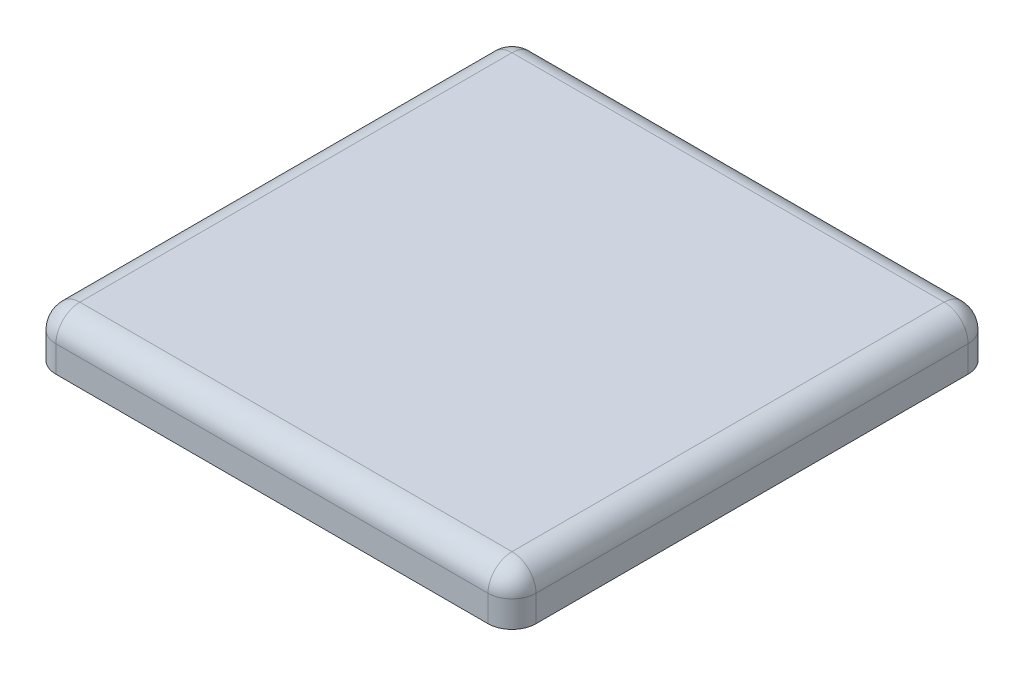
ISO-10303-21;
HEADER;
FILE_DESCRIPTION(('STEP AP214'),'2;1');
FILE_NAME('part.step','',(''),(''),'','','');
FILE_SCHEMA(('AUTOMOTIVE_DESIGN { 1 0 10303 214 1 1 1 1 }'));
ENDSEC;
DATA;
#1=APPLICATION_CONTEXT('core data for automotive mechanical design processes');
#2=APPLICATION_PROTOCOL_DEFINITION('international standard','automotive_design',2000,#1);
#3=PRODUCT_CONTEXT('',#1,'mechanical');
#4=PRODUCT('Part','Part','',(#3));
#5=PRODUCT_RELATED_PRODUCT_CATEGORY('part','',(#4));
#6=PRODUCT_DEFINITION_FORMATION('','',#4);
#7=PRODUCT_DEFINITION_CONTEXT('part definition',#1,'design');
#8=PRODUCT_DEFINITION('design','',#6,#7);
#9=PRODUCT_DEFINITION_SHAPE('','',#8);
#10=(LENGTH_UNIT() NAMED_UNIT(*) SI_UNIT(.MILLI.,.METRE.));
#11=(NAMED_UNIT(*) PLANE_ANGLE_UNIT() SI_UNIT($,.RADIAN.));
#12=(NAMED_UNIT(*) SI_UNIT($,.STERADIAN.) SOLID_ANGLE_UNIT());
#13=UNCERTAINTY_MEASURE_WITH_UNIT(LENGTH_MEASURE(1.E-05),#10,'distance_accuracy_value','');
#14=(GEOMETRIC_REPRESENTATION_CONTEXT(3) GLOBAL_UNCERTAINTY_ASSIGNED_CONTEXT((#13)) GLOBAL_UNIT_ASSIGNED_CONTEXT((#10,
#11,#12)) REPRESENTATION_CONTEXT('',''));
#15=CARTESIAN_POINT('',(0.,0.,0.));
#16=DIRECTION('',(0.,0.,1.));
#17=DIRECTION('',(1.,0.,0.));
#18=AXIS2_PLACEMENT_3D('',#15,#16,#17);
#19=CARTESIAN_POINT('',(-18.,4.2,-18.));
#20=DIRECTION('',(0.,-1.,0.));
#21=DIRECTION('',(0.,0.,-1.));
#22=AXIS2_PLACEMENT_3D('',#19,#20,#21);
#23=CYLINDRICAL_SURFACE('',#22,2.);
#24=DIRECTION('',(0.,-1.,0.));
#25=VECTOR('',#24,1.);
#26=CARTESIAN_POINT('',(-20.,4.2,-18.));
#27=LINE('',#26,#25);
#28=CARTESIAN_POINT('',(-20.,2.2,-18.));
#29=VERTEX_POINT('',#28);
#30=CARTESIAN_POINT('',(-20.,0.,-18.));
#31=VERTEX_POINT('',#30);
#32=EDGE_CURVE('E111',#29,#31,#27,.T.);
#33=ORIENTED_EDGE('',*,*,#32,.F.);
#34=CARTESIAN_POINT('',(-18.,2.2,-18.));
#35=DIRECTION('',(0.,-1.,0.));
#36=DIRECTION('',(0.,0.,-1.));
#37=AXIS2_PLACEMENT_3D('',#34,#35,#36);
#38=CIRCLE('',#37,2.);
#39=CARTESIAN_POINT('',(-18.,2.2,-20.));
#40=VERTEX_POINT('',#39);
#41=EDGE_CURVE('E185',#29,#40,#38,.T.);
#42=ORIENTED_EDGE('',*,*,#41,.T.);
#43=DIRECTION('',(0.,-1.,0.));
#44=VECTOR('',#43,1.);
#45=CARTESIAN_POINT('',(-18.,4.2,-20.));
#46=LINE('',#45,#44);
#47=CARTESIAN_POINT('',(-18.,0.,-20.));
#48=VERTEX_POINT('',#47);
#49=EDGE_CURVE('E134',#40,#48,#46,.T.);
#50=ORIENTED_EDGE('',*,*,#49,.T.);
#51=CARTESIAN_POINT('',(-18.,0.,-18.));
#52=DIRECTION('',(0.,1.,0.));
#53=DIRECTION('',(0.,0.,1.));
#54=AXIS2_PLACEMENT_3D('',#51,#52,#53);
#55=CIRCLE('',#54,2.);
#56=EDGE_CURVE('E129',#48,#31,#55,.T.);
#57=ORIENTED_EDGE('',*,*,#56,.T.);
#58=EDGE_LOOP('',(#33,#42,#50,#57));
#59=FACE_BOUND('',#58,.T.);
#60=ADVANCED_FACE('F33',(#59),#23,.T.);
#61=CARTESIAN_POINT('',(-20.,4.2,18.));
#62=DIRECTION('',(1.,0.,0.));
#63=DIRECTION('',(0.,0.,-1.));
#64=AXIS2_PLACEMENT_3D('',#61,#62,#63);
#65=PLANE('',#64);
#66=DIRECTION('',(0.,-1.,0.));
#67=VECTOR('',#66,1.);
#68=CARTESIAN_POINT('',(-20.,4.2,18.));
#69=LINE('',#68,#67);
#70=CARTESIAN_POINT('',(-20.,2.2,18.));
#71=VERTEX_POINT('',#70);
#72=CARTESIAN_POINT('',(-20.,0.,18.));
#73=VERTEX_POINT('',#72);
#74=EDGE_CURVE('E123',#71,#73,#69,.T.);
#75=ORIENTED_EDGE('',*,*,#74,.F.);
#76=DIRECTION('',(0.,0.,1.));
#77=VECTOR('',#76,1.);
#78=CARTESIAN_POINT('',(-20.,2.2,-18.));
#79=LINE('',#78,#77);
#80=EDGE_CURVE('E118',#71,#29,#79,.F.);
#81=ORIENTED_EDGE('',*,*,#80,.T.);
#82=ORIENTED_EDGE('',*,*,#32,.T.);
#83=DIRECTION('',(0.,0.,1.));
#84=VECTOR('',#83,1.);
#85=CARTESIAN_POINT('',(-20.,0.,18.));
#86=LINE('',#85,#84);
#87=EDGE_CURVE('E115',#31,#73,#86,.T.);
#88=ORIENTED_EDGE('',*,*,#87,.T.);
#89=EDGE_LOOP('',(#75,#81,#82,#88));
#90=FACE_BOUND('',#89,.T.);
#91=ADVANCED_FACE('F114',(#90),#65,.F.);
#92=CARTESIAN_POINT('',(-18.,4.2,18.));
#93=DIRECTION('',(0.,-1.,0.));
#94=DIRECTION('',(0.,0.,-1.));
#95=AXIS2_PLACEMENT_3D('',#92,#93,#94);
#96=CYLINDRICAL_SURFACE('',#95,1.99999999999999);
#97=DIRECTION('',(0.,-1.,0.));
#98=VECTOR('',#97,1.);
#99=CARTESIAN_POINT('',(-18.,4.2,20.));
#100=LINE('',#99,#98);
#101=CARTESIAN_POINT('',(-18.,2.2,20.));
#102=VERTEX_POINT('',#101);
#103=CARTESIAN_POINT('',(-18.,0.,20.));
#104=VERTEX_POINT('',#103);
#105=EDGE_CURVE('E166',#102,#104,#100,.T.);
#106=ORIENTED_EDGE('',*,*,#105,.F.);
#107=CARTESIAN_POINT('',(-18.,2.2,18.));
#108=DIRECTION('',(0.,-1.,0.));
#109=DIRECTION('',(0.,0.,-1.));
#110=AXIS2_PLACEMENT_3D('',#107,#108,#109);
#111=CIRCLE('',#110,1.99999999999999);
#112=EDGE_CURVE('E182',#102,#71,#111,.T.);
#113=ORIENTED_EDGE('',*,*,#112,.T.);
#114=ORIENTED_EDGE('',*,*,#74,.T.);
#115=CARTESIAN_POINT('',(-18.,0.,18.));
#116=DIRECTION('',(0.,1.,0.));
#117=DIRECTION('',(0.,0.,-1.));
#118=AXIS2_PLACEMENT_3D('',#115,#116,#117);
#119=CIRCLE('',#118,1.99999999999999);
#120=EDGE_CURVE('E132',#73,#104,#119,.T.);
#121=ORIENTED_EDGE('',*,*,#120,.T.);
#122=EDGE_LOOP('',(#106,#113,#114,#121));
#123=FACE_BOUND('',#122,.T.);
#124=ADVANCED_FACE('F229',(#123),#96,.T.);
#125=CARTESIAN_POINT('',(-18.,4.2,20.));
#126=DIRECTION('',(0.,0.,-1.));
#127=DIRECTION('',(-1.,0.,0.));
#128=AXIS2_PLACEMENT_3D('',#125,#126,#127);
#129=PLANE('',#128);
#130=DIRECTION('',(0.,-1.,0.));
#131=VECTOR('',#130,1.);
#132=CARTESIAN_POINT('',(18.,4.2,20.));
#133=LINE('',#132,#131);
#134=CARTESIAN_POINT('',(18.,2.2,20.));
#135=VERTEX_POINT('',#134);
#136=CARTESIAN_POINT('',(18.,0.,20.));
#137=VERTEX_POINT('',#136);
#138=EDGE_CURVE('E164',#135,#137,#133,.T.);
#139=ORIENTED_EDGE('',*,*,#138,.F.);
#140=DIRECTION('',(1.,0.,0.));
#141=VECTOR('',#140,1.);
#142=CARTESIAN_POINT('',(-18.,2.2,20.));
#143=LINE('',#142,#141);
#144=EDGE_CURVE('E180',#135,#102,#143,.F.);
#145=ORIENTED_EDGE('',*,*,#144,.T.);
#146=ORIENTED_EDGE('',*,*,#105,.T.);
#147=DIRECTION('',(1.,0.,0.));
#148=VECTOR('',#147,1.);
#149=CARTESIAN_POINT('',(-18.,0.,20.));
#150=LINE('',#149,#148);
#151=EDGE_CURVE('E143',#104,#137,#150,.T.);
#152=ORIENTED_EDGE('',*,*,#151,.T.);
#153=EDGE_LOOP('',(#139,#145,#146,#152));
#154=FACE_BOUND('',#153,.T.);
#155=ADVANCED_FACE('F293',(#154),#129,.F.);
#156=CARTESIAN_POINT('',(18.,4.2,18.));
#157=DIRECTION('',(0.,-1.,0.));
#158=DIRECTION('',(0.,0.,-1.));
#159=AXIS2_PLACEMENT_3D('',#156,#157,#158);
#160=CYLINDRICAL_SURFACE('',#159,2.);
#161=DIRECTION('',(0.,-1.,0.));
#162=VECTOR('',#161,1.);
#163=CARTESIAN_POINT('',(20.,4.2,18.));
#164=LINE('',#163,#162);
#165=CARTESIAN_POINT('',(20.,2.2,18.));
#166=VERTEX_POINT('',#165);
#167=CARTESIAN_POINT('',(20.,0.,18.));
#168=VERTEX_POINT('',#167);
#169=EDGE_CURVE('E162',#166,#168,#164,.T.);
#170=ORIENTED_EDGE('',*,*,#169,.F.);
#171=CARTESIAN_POINT('',(18.,2.2,18.));
#172=DIRECTION('',(0.,-1.,0.));
#173=DIRECTION('',(0.,0.,-1.));
#174=AXIS2_PLACEMENT_3D('',#171,#172,#173);
#175=CIRCLE('',#174,2.);
#176=EDGE_CURVE('E122',#166,#135,#175,.T.);
#177=ORIENTED_EDGE('',*,*,#176,.T.);
#178=ORIENTED_EDGE('',*,*,#138,.T.);
#179=CARTESIAN_POINT('',(18.,0.,18.));
#180=DIRECTION('',(0.,1.,0.));
#181=DIRECTION('',(0.,0.,1.));
#182=AXIS2_PLACEMENT_3D('',#179,#180,#181);
#183=CIRCLE('',#182,2.);
#184=EDGE_CURVE('E146',#137,#168,#183,.T.);
#185=ORIENTED_EDGE('',*,*,#184,.T.);
#186=EDGE_LOOP('',(#170,#177,#178,#185));
#187=FACE_BOUND('',#186,.T.);
#188=ADVANCED_FACE('F283',(#187),#160,.T.);
#189=CARTESIAN_POINT('',(20.,4.2,18.));
#190=DIRECTION('',(-1.,0.,0.));
#191=DIRECTION('',(0.,0.,1.));
#192=AXIS2_PLACEMENT_3D('',#189,#190,#191);
#193=PLANE('',#192);
#194=DIRECTION('',(0.,-1.,0.));
#195=VECTOR('',#194,1.);
#196=CARTESIAN_POINT('',(20.,4.2,-18.));
#197=LINE('',#196,#195);
#198=CARTESIAN_POINT('',(20.,2.2,-18.));
#199=VERTEX_POINT('',#198);
#200=CARTESIAN_POINT('',(20.,0.,-18.));
#201=VERTEX_POINT('',#200);
#202=EDGE_CURVE('E160',#199,#201,#197,.T.);
#203=ORIENTED_EDGE('',*,*,#202,.F.);
#204=DIRECTION('',(0.,0.,-1.));
#205=VECTOR('',#204,1.);
#206=CARTESIAN_POINT('',(20.,2.2,18.));
#207=LINE('',#206,#205);
#208=EDGE_CURVE('E189',#199,#166,#207,.F.);
#209=ORIENTED_EDGE('',*,*,#208,.T.);
#210=ORIENTED_EDGE('',*,*,#169,.T.);
#211=DIRECTION('',(0.,0.,-1.));
#212=VECTOR('',#211,1.);
#213=CARTESIAN_POINT('',(20.,0.,18.));
#214=LINE('',#213,#212);
#215=EDGE_CURVE('E149',#168,#201,#214,.T.);
#216=ORIENTED_EDGE('',*,*,#215,.T.);
#217=EDGE_LOOP('',(#203,#209,#210,#216));
#218=FACE_BOUND('',#217,.T.);
#219=ADVANCED_FACE('F280',(#218),#193,.F.);
#220=CARTESIAN_POINT('',(18.,4.2,-18.));
#221=DIRECTION('',(0.,-1.,0.));
#222=DIRECTION('',(0.,0.,-1.));
#223=AXIS2_PLACEMENT_3D('',#220,#221,#222);
#224=CYLINDRICAL_SURFACE('',#223,2.);
#225=DIRECTION('',(0.,-1.,0.));
#226=VECTOR('',#225,1.);
#227=CARTESIAN_POINT('',(18.,4.2,-20.));
#228=LINE('',#227,#226);
#229=CARTESIAN_POINT('',(18.,2.2,-20.));
#230=VERTEX_POINT('',#229);
#231=CARTESIAN_POINT('',(18.,0.,-20.));
#232=VERTEX_POINT('',#231);
#233=EDGE_CURVE('E158',#230,#232,#228,.T.);
#234=ORIENTED_EDGE('',*,*,#233,.F.);
#235=CARTESIAN_POINT('',(18.,2.2,-18.));
#236=DIRECTION('',(0.,-1.,0.));
#237=DIRECTION('',(0.,0.,-1.));
#238=AXIS2_PLACEMENT_3D('',#235,#236,#237);
#239=CIRCLE('',#238,2.);
#240=EDGE_CURVE('E48',#230,#199,#239,.T.);
#241=ORIENTED_EDGE('',*,*,#240,.T.);
#242=ORIENTED_EDGE('',*,*,#202,.T.);
#243=CARTESIAN_POINT('',(18.,0.,-18.));
#244=DIRECTION('',(0.,1.,0.));
#245=DIRECTION('',(0.,0.,-1.));
#246=AXIS2_PLACEMENT_3D('',#243,#244,#245);
#247=CIRCLE('',#246,2.);
#248=EDGE_CURVE('E152',#201,#232,#247,.T.);
#249=ORIENTED_EDGE('',*,*,#248,.T.);
#250=EDGE_LOOP('',(#234,#241,#242,#249));
#251=FACE_BOUND('',#250,.T.);
#252=ADVANCED_FACE('F304',(#251),#224,.T.);
#253=CARTESIAN_POINT('',(-18.,4.2,-20.));
#254=DIRECTION('',(0.,0.,1.));
#255=DIRECTION('',(1.,0.,0.));
#256=AXIS2_PLACEMENT_3D('',#253,#254,#255);
#257=PLANE('',#256);
#258=ORIENTED_EDGE('',*,*,#49,.F.);
#259=DIRECTION('',(-1.,0.,0.));
#260=VECTOR('',#259,1.);
#261=CARTESIAN_POINT('',(18.,2.2,-20.));
#262=LINE('',#261,#260);
#263=EDGE_CURVE('E56',#40,#230,#262,.F.);
#264=ORIENTED_EDGE('',*,*,#263,.T.);
#265=ORIENTED_EDGE('',*,*,#233,.T.);
#266=DIRECTION('',(-1.,0.,0.));
#267=VECTOR('',#266,1.);
#268=CARTESIAN_POINT('',(-18.,0.,-20.));
#269=LINE('',#268,#267);
#270=EDGE_CURVE('E155',#232,#48,#269,.T.);
#271=ORIENTED_EDGE('',*,*,#270,.T.);
#272=EDGE_LOOP('',(#258,#264,#265,#271));
#273=FACE_BOUND('',#272,.T.);
#274=ADVANCED_FACE('F299',(#273),#257,.F.);
#275=CARTESIAN_POINT('',(-18.,4.2,-18.));
#276=DIRECTION('',(0.,1.,0.));
#277=DIRECTION('',(0.,0.,1.));
#278=AXIS2_PLACEMENT_3D('',#275,#276,#277);
#279=PLANE('',#278);
#280=DIRECTION('',(0.,0.,1.));
#281=VECTOR('',#280,1.);
#282=CARTESIAN_POINT('',(-18.,4.2,18.));
#283=LINE('',#282,#281);
#284=CARTESIAN_POINT('',(-18.,4.2,-18.));
#285=VERTEX_POINT('',#284);
#286=CARTESIAN_POINT('',(-18.,4.2,18.));
#287=VERTEX_POINT('',#286);
#288=EDGE_CURVE('E175',#285,#287,#283,.T.);
#289=ORIENTED_EDGE('',*,*,#288,.T.);
#290=DIRECTION('',(1.,0.,0.));
#291=VECTOR('',#290,1.);
#292=CARTESIAN_POINT('',(18.,4.2,18.));
#293=LINE('',#292,#291);
#294=CARTESIAN_POINT('',(18.,4.2,18.));
#295=VERTEX_POINT('',#294);
#296=EDGE_CURVE('E177',#287,#295,#293,.T.);
#297=ORIENTED_EDGE('',*,*,#296,.T.);
#298=DIRECTION('',(0.,0.,-1.));
#299=VECTOR('',#298,1.);
#300=CARTESIAN_POINT('',(18.,4.2,-18.));
#301=LINE('',#300,#299);
#302=CARTESIAN_POINT('',(18.,4.2,-18.));
#303=VERTEX_POINT('',#302);
#304=EDGE_CURVE('E171',#295,#303,#301,.T.);
#305=ORIENTED_EDGE('',*,*,#304,.T.);
#306=DIRECTION('',(-1.,0.,0.));
#307=VECTOR('',#306,1.);
#308=CARTESIAN_POINT('',(-18.,4.2,-18.));
#309=LINE('',#308,#307);
#310=EDGE_CURVE('E173',#303,#285,#309,.T.);
#311=ORIENTED_EDGE('',*,*,#310,.T.);
#312=EDGE_LOOP('',(#289,#297,#305,#311));
#313=FACE_BOUND('',#312,.T.);
#314=ADVANCED_FACE('F266',(#313),#279,.T.);
#315=CARTESIAN_POINT('',(-18.,0.,-18.));
#316=DIRECTION('',(0.,1.,0.));
#317=DIRECTION('',(0.,0.,1.));
#318=AXIS2_PLACEMENT_3D('',#315,#316,#317);
#319=PLANE('',#318);
#320=CARTESIAN_POINT('',(0.,0.,0.));
#321=DIRECTION('',(0.,1.,0.));
#322=DIRECTION('',(0.,0.,1.));
#323=AXIS2_PLACEMENT_3D('',#320,#321,#322);
#324=CIRCLE('',#323,3.5);
#325=CARTESIAN_POINT('',(0.,0.,3.5));
#326=VERTEX_POINT('',#325);
#327=EDGE_CURVE('E191',#326,#326,#324,.F.);
#328=ORIENTED_EDGE('',*,*,#327,.F.);
#329=EDGE_LOOP('',(#328));
#330=FACE_BOUND('',#329,.T.);
#331=ORIENTED_EDGE('',*,*,#56,.F.);
#332=ORIENTED_EDGE('',*,*,#270,.F.);
#333=ORIENTED_EDGE('',*,*,#248,.F.);
#334=ORIENTED_EDGE('',*,*,#215,.F.);
#335=ORIENTED_EDGE('',*,*,#184,.F.);
#336=ORIENTED_EDGE('',*,*,#151,.F.);
#337=ORIENTED_EDGE('',*,*,#120,.F.);
#338=ORIENTED_EDGE('',*,*,#87,.F.);
#339=EDGE_LOOP('',(#331,#332,#333,#334,#335,#336,#337,#338));
#340=FACE_BOUND('',#339,.T.);
#341=ADVANCED_FACE('F127',(#330,#340),#319,.F.);
#342=CARTESIAN_POINT('',(-18.,2.2,-18.));
#343=DIRECTION('',(0.,1.,0.));
#344=DIRECTION('',(0.,0.,1.));
#345=AXIS2_PLACEMENT_3D('',#342,#343,#344);
#346=SPHERICAL_SURFACE('',#345,2.);
#347=CARTESIAN_POINT('',(-18.,2.2,-18.));
#348=DIRECTION('',(1.,0.,0.));
#349=DIRECTION('',(0.,0.,-1.));
#350=AXIS2_PLACEMENT_3D('',#347,#348,#349);
#351=CIRCLE('',#350,2.);
#352=EDGE_CURVE('E139',#40,#285,#351,.T.);
#353=ORIENTED_EDGE('',*,*,#352,.F.);
#354=ORIENTED_EDGE('',*,*,#41,.F.);
#355=CARTESIAN_POINT('',(-18.,2.2,-18.));
#356=DIRECTION('',(0.,0.,1.));
#357=DIRECTION('',(1.,0.,0.));
#358=AXIS2_PLACEMENT_3D('',#355,#356,#357);
#359=CIRCLE('',#358,2.);
#360=EDGE_CURVE('E136',#285,#29,#359,.T.);
#361=ORIENTED_EDGE('',*,*,#360,.F.);
#362=EDGE_LOOP('',(#353,#354,#361));
#363=FACE_BOUND('',#362,.T.);
#364=ADVANCED_FACE('F259',(#363),#346,.T.);
#365=CARTESIAN_POINT('',(-18.,2.2,-18.));
#366=DIRECTION('',(0.,0.,-1.));
#367=DIRECTION('',(-1.,0.,0.));
#368=AXIS2_PLACEMENT_3D('',#365,#366,#367);
#369=CYLINDRICAL_SURFACE('',#368,2.);
#370=ORIENTED_EDGE('',*,*,#360,.T.);
#371=ORIENTED_EDGE('',*,*,#80,.F.);
#372=CARTESIAN_POINT('',(-18.,2.2,18.));
#373=DIRECTION('',(0.,0.,1.));
#374=DIRECTION('',(1.,0.,0.));
#375=AXIS2_PLACEMENT_3D('',#372,#373,#374);
#376=CIRCLE('',#375,2.);
#377=EDGE_CURVE('E205',#287,#71,#376,.T.);
#378=ORIENTED_EDGE('',*,*,#377,.F.);
#379=ORIENTED_EDGE('',*,*,#288,.F.);
#380=EDGE_LOOP('',(#370,#371,#378,#379));
#381=FACE_BOUND('',#380,.T.);
#382=ADVANCED_FACE('F256',(#381),#369,.T.);
#383=CARTESIAN_POINT('',(-18.,2.2,-18.));
#384=DIRECTION('',(1.,0.,0.));
#385=DIRECTION('',(0.,0.,-1.));
#386=AXIS2_PLACEMENT_3D('',#383,#384,#385);
#387=CYLINDRICAL_SURFACE('',#386,2.);
#388=ORIENTED_EDGE('',*,*,#352,.T.);
#389=ORIENTED_EDGE('',*,*,#310,.F.);
#390=CARTESIAN_POINT('',(18.,2.2,-18.));
#391=DIRECTION('',(1.,0.,0.));
#392=DIRECTION('',(0.,0.,-1.));
#393=AXIS2_PLACEMENT_3D('',#390,#391,#392);
#394=CIRCLE('',#393,2.);
#395=EDGE_CURVE('E202',#230,#303,#394,.T.);
#396=ORIENTED_EDGE('',*,*,#395,.F.);
#397=ORIENTED_EDGE('',*,*,#263,.F.);
#398=EDGE_LOOP('',(#388,#389,#396,#397));
#399=FACE_BOUND('',#398,.T.);
#400=ADVANCED_FACE('F252',(#399),#387,.T.);
#401=CARTESIAN_POINT('',(-18.,2.2,18.));
#402=DIRECTION('',(0.,1.,0.));
#403=DIRECTION('',(0.,0.,1.));
#404=AXIS2_PLACEMENT_3D('',#401,#402,#403);
#405=SPHERICAL_SURFACE('',#404,2.);
#406=ORIENTED_EDGE('',*,*,#377,.T.);
#407=ORIENTED_EDGE('',*,*,#112,.F.);
#408=CARTESIAN_POINT('',(-18.,2.2,18.));
#409=DIRECTION('',(1.,0.,0.));
#410=DIRECTION('',(0.,0.,-1.));
#411=AXIS2_PLACEMENT_3D('',#408,#409,#410);
#412=CIRCLE('',#411,2.);
#413=EDGE_CURVE('E199',#287,#102,#412,.T.);
#414=ORIENTED_EDGE('',*,*,#413,.F.);
#415=EDGE_LOOP('',(#406,#407,#414));
#416=FACE_BOUND('',#415,.T.);
#417=ADVANCED_FACE('F248',(#416),#405,.T.);
#418=CARTESIAN_POINT('',(18.,2.2,-18.));
#419=DIRECTION('',(0.,1.,0.));
#420=DIRECTION('',(0.,0.,1.));
#421=AXIS2_PLACEMENT_3D('',#418,#419,#420);
#422=SPHERICAL_SURFACE('',#421,2.);
#423=ORIENTED_EDGE('',*,*,#240,.F.);
#424=ORIENTED_EDGE('',*,*,#395,.T.);
#425=CARTESIAN_POINT('',(18.,2.2,-18.));
#426=DIRECTION('',(0.,0.,1.));
#427=DIRECTION('',(1.,0.,0.));
#428=AXIS2_PLACEMENT_3D('',#425,#426,#427);
#429=CIRCLE('',#428,2.);
#430=EDGE_CURVE('E196',#199,#303,#429,.T.);
#431=ORIENTED_EDGE('',*,*,#430,.F.);
#432=EDGE_LOOP('',(#423,#424,#431));
#433=FACE_BOUND('',#432,.T.);
#434=ADVANCED_FACE('F244',(#433),#422,.T.);
#435=CARTESIAN_POINT('',(-18.,2.2,18.));
#436=DIRECTION('',(-1.,0.,0.));
#437=DIRECTION('',(0.,0.,1.));
#438=AXIS2_PLACEMENT_3D('',#435,#436,#437);
#439=CYLINDRICAL_SURFACE('',#438,2.);
#440=ORIENTED_EDGE('',*,*,#413,.T.);
#441=ORIENTED_EDGE('',*,*,#144,.F.);
#442=CARTESIAN_POINT('',(18.,2.2,18.));
#443=DIRECTION('',(1.,0.,0.));
#444=DIRECTION('',(0.,0.,-1.));
#445=AXIS2_PLACEMENT_3D('',#442,#443,#444);
#446=CIRCLE('',#445,2.);
#447=EDGE_CURVE('E194',#295,#135,#446,.T.);
#448=ORIENTED_EDGE('',*,*,#447,.F.);
#449=ORIENTED_EDGE('',*,*,#296,.F.);
#450=EDGE_LOOP('',(#440,#441,#448,#449));
#451=FACE_BOUND('',#450,.T.);
#452=ADVANCED_FACE('F240',(#451),#439,.T.);
#453=CARTESIAN_POINT('',(18.,2.2,-18.));
#454=DIRECTION('',(0.,0.,1.));
#455=DIRECTION('',(1.,0.,0.));
#456=AXIS2_PLACEMENT_3D('',#453,#454,#455);
#457=CYLINDRICAL_SURFACE('',#456,2.);
#458=ORIENTED_EDGE('',*,*,#430,.T.);
#459=ORIENTED_EDGE('',*,*,#304,.F.);
#460=CARTESIAN_POINT('',(18.,2.2,18.));
#461=DIRECTION('',(0.,0.,1.));
#462=DIRECTION('',(0.,-1.,0.));
#463=AXIS2_PLACEMENT_3D('',#460,#461,#462);
#464=CIRCLE('',#463,2.);
#465=EDGE_CURVE('E192',#166,#295,#464,.T.);
#466=ORIENTED_EDGE('',*,*,#465,.F.);
#467=ORIENTED_EDGE('',*,*,#208,.F.);
#468=EDGE_LOOP('',(#458,#459,#466,#467));
#469=FACE_BOUND('',#468,.T.);
#470=ADVANCED_FACE('F236',(#469),#457,.T.);
#471=CARTESIAN_POINT('',(18.,2.2,18.));
#472=DIRECTION('',(0.,1.,0.));
#473=DIRECTION('',(0.,0.,1.));
#474=AXIS2_PLACEMENT_3D('',#471,#472,#473);
#475=SPHERICAL_SURFACE('',#474,2.);
#476=ORIENTED_EDGE('',*,*,#447,.T.);
#477=ORIENTED_EDGE('',*,*,#176,.F.);
#478=ORIENTED_EDGE('',*,*,#465,.T.);
#479=EDGE_LOOP('',(#476,#477,#478));
#480=FACE_BOUND('',#479,.T.);
#481=ADVANCED_FACE('F233',(#480),#475,.T.);
#482=CARTESIAN_POINT('',(0.,-10.,0.));
#483=DIRECTION('',(0.,1.,0.));
#484=DIRECTION('',(0.,0.,1.));
#485=AXIS2_PLACEMENT_3D('',#482,#483,#484);
#486=CYLINDRICAL_SURFACE('',#485,3.5);
#487=CARTESIAN_POINT('',(0.,-6.99999999999999,0.));
#488=DIRECTION('',(0.,-1.,0.));
#489=DIRECTION('',(0.,0.,-1.));
#490=AXIS2_PLACEMENT_3D('',#487,#488,#489);
#491=CIRCLE('',#490,3.5);
#492=CARTESIAN_POINT('',(0.,-6.99999999999999,-3.5));
#493=VERTEX_POINT('',#492);
#494=EDGE_CURVE('E11',#493,#493,#491,.F.);
#495=ORIENTED_EDGE('',*,*,#494,.T.);
#496=EDGE_LOOP('',(#495));
#497=FACE_BOUND('',#496,.T.);
#498=ORIENTED_EDGE('',*,*,#327,.T.);
#499=EDGE_LOOP('',(#498));
#500=FACE_BOUND('',#499,.T.);
#501=ADVANCED_FACE('F221',(#497,#500),#486,.T.);
#502=CARTESIAN_POINT('',(0.,-10.,0.));
#503=DIRECTION('',(0.,-1.,0.));
#504=DIRECTION('',(0.,0.,-1.));
#505=AXIS2_PLACEMENT_3D('',#502,#503,#504);
#506=PLANE('',#505);
#507=CARTESIAN_POINT('',(0.,-10.,0.));
#508=DIRECTION('',(0.,-1.,0.));
#509=DIRECTION('',(0.,0.,-1.));
#510=AXIS2_PLACEMENT_3D('',#507,#508,#509);
#511=CIRCLE('',#510,2.4080892972014);
#512=CARTESIAN_POINT('',(0.,-10.,-2.4080892972014));
#513=VERTEX_POINT('',#512);
#514=EDGE_CURVE('E41',#513,#513,#511,.T.);
#515=ORIENTED_EDGE('',*,*,#514,.T.);
#516=EDGE_LOOP('',(#515));
#517=FACE_BOUND('',#516,.T.);
#518=ADVANCED_FACE('F214',(#517),#506,.T.);
#519=CARTESIAN_POINT('',(0.,-10.,0.));
#520=DIRECTION('',(0.,1.,0.));
#521=DIRECTION('',(0.,0.,1.));
#522=AXIS2_PLACEMENT_3D('',#519,#520,#521);
#523=CONICAL_SURFACE('',#522,2.4080892972014,0.349065850398864);
#524=ORIENTED_EDGE('',*,*,#494,.F.);
#525=EDGE_LOOP('',(#524));
#526=FACE_BOUND('',#525,.T.);
#527=ORIENTED_EDGE('',*,*,#514,.F.);
#528=EDGE_LOOP('',(#527));
#529=FACE_BOUND('',#528,.T.);
#530=ADVANCED_FACE('F35',(#526,#529),#523,.T.);
#531=CLOSED_SHELL('',(#60,#91,#124,#155,#188,#219,#252,#274,#314,#341,#364,#382,#400,#417,#434,
#452,#470,#481,#501,#518,#530));
#532=MANIFOLD_SOLID_BREP('B2',#531);
#533=ADVANCED_BREP_SHAPE_REPRESENTATION('',(#18,#532),#14);
#534=SHAPE_DEFINITION_REPRESENTATION(#9,#533);
ENDSEC;
END-ISO-10303-21;
